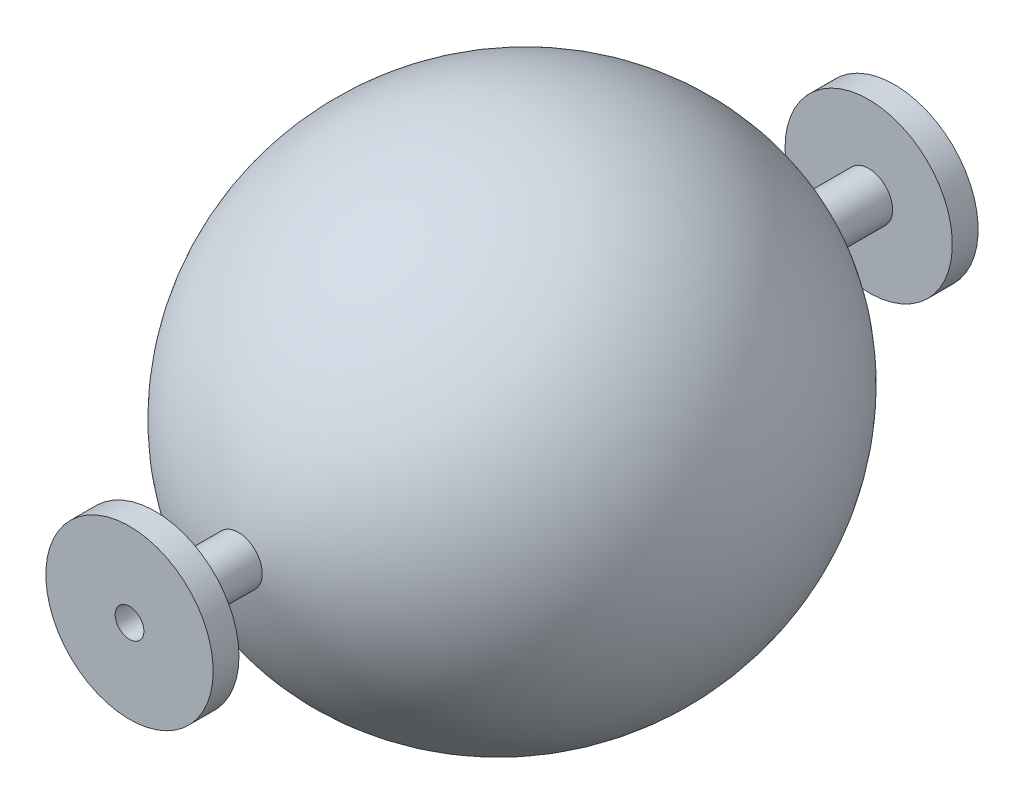
ISO-10303-21;
HEADER;
FILE_DESCRIPTION(('STEP AP214'),'2;1');
FILE_NAME('part.step','',(''),(''),'','','');
FILE_SCHEMA(('AUTOMOTIVE_DESIGN { 1 0 10303 214 1 1 1 1 }'));
ENDSEC;
DATA;
#1=APPLICATION_CONTEXT('core data for automotive mechanical design processes');
#2=APPLICATION_PROTOCOL_DEFINITION('international standard','automotive_design',2000,#1);
#3=PRODUCT_CONTEXT('',#1,'mechanical');
#4=PRODUCT('Part','Part','',(#3));
#5=PRODUCT_RELATED_PRODUCT_CATEGORY('part','',(#4));
#6=PRODUCT_DEFINITION_FORMATION('','',#4);
#7=PRODUCT_DEFINITION_CONTEXT('part definition',#1,'design');
#8=PRODUCT_DEFINITION('design','',#6,#7);
#9=PRODUCT_DEFINITION_SHAPE('','',#8);
#10=(LENGTH_UNIT() NAMED_UNIT(*) SI_UNIT(.MILLI.,.METRE.));
#11=(NAMED_UNIT(*) PLANE_ANGLE_UNIT() SI_UNIT($,.RADIAN.));
#12=(NAMED_UNIT(*) SI_UNIT($,.STERADIAN.) SOLID_ANGLE_UNIT());
#13=UNCERTAINTY_MEASURE_WITH_UNIT(LENGTH_MEASURE(1.E-05),#10,'distance_accuracy_value','');
#14=(GEOMETRIC_REPRESENTATION_CONTEXT(3) GLOBAL_UNCERTAINTY_ASSIGNED_CONTEXT((#13)) GLOBAL_UNIT_ASSIGNED_CONTEXT((#10,
#11,#12)) REPRESENTATION_CONTEXT('',''));
#15=CARTESIAN_POINT('',(0.,0.,0.));
#16=DIRECTION('',(0.,0.,1.));
#17=DIRECTION('',(1.,0.,0.));
#18=AXIS2_PLACEMENT_3D('',#15,#16,#17);
#19=CARTESIAN_POINT('',(0.,0.,40.001));
#20=DIRECTION('',(0.,0.,-1.));
#21=DIRECTION('',(-1.,0.,0.));
#22=AXIS2_PLACEMENT_3D('',#19,#20,#21);
#23=CYLINDRICAL_SURFACE('',#22,2.5);
#24=CARTESIAN_POINT('',(0.,0.,-28.6161600391215));
#25=DIRECTION('',(0.,0.,1.));
#26=DIRECTION('',(1.,0.,0.));
#27=AXIS2_PLACEMENT_3D('',#24,#25,#26);
#28=CIRCLE('',#27,2.5);
#29=CARTESIAN_POINT('',(2.5,0.,-28.6161600391215));
#30=VERTEX_POINT('',#29);
#31=EDGE_CURVE('E43',#30,#30,#28,.F.);
#32=ORIENTED_EDGE('',*,*,#31,.T.);
#33=EDGE_LOOP('',(#32));
#34=FACE_BOUND('',#33,.T.);
#35=CARTESIAN_POINT('',(0.,0.,-37.3));
#36=DIRECTION('',(0.,0.,-1.));
#37=DIRECTION('',(-1.,0.,0.));
#38=AXIS2_PLACEMENT_3D('',#35,#36,#37);
#39=CIRCLE('',#38,2.5);
#40=CARTESIAN_POINT('',(-2.5,0.,-37.3));
#41=VERTEX_POINT('',#40);
#42=EDGE_CURVE('E10',#41,#41,#39,.T.);
#43=ORIENTED_EDGE('',*,*,#42,.F.);
#44=EDGE_LOOP('',(#43));
#45=FACE_BOUND('',#44,.T.);
#46=ADVANCED_FACE('F30',(#34,#45),#23,.T.);
#47=CARTESIAN_POINT('',(0.,0.,-29.001));
#48=DIRECTION('',(0.,0.,1.));
#49=DIRECTION('',(1.,0.,0.));
#50=AXIS2_PLACEMENT_3D('',#47,#48,#49);
#51=CYLINDRICAL_SURFACE('',#50,2.5);
#52=CARTESIAN_POINT('',(0.,0.,28.6161600391215));
#53=DIRECTION('',(0.,0.,-1.));
#54=DIRECTION('',(-1.,0.,0.));
#55=AXIS2_PLACEMENT_3D('',#52,#53,#54);
#56=CIRCLE('',#55,2.5);
#57=CARTESIAN_POINT('',(-2.49999999999999,0.,28.6161600391215));
#58=VERTEX_POINT('',#57);
#59=EDGE_CURVE('E38',#58,#58,#56,.F.);
#60=ORIENTED_EDGE('',*,*,#59,.T.);
#61=EDGE_LOOP('',(#60));
#62=FACE_BOUND('',#61,.T.);
#63=CARTESIAN_POINT('',(0.,0.,37.3));
#64=DIRECTION('',(0.,0.,1.));
#65=DIRECTION('',(1.,0.,0.));
#66=AXIS2_PLACEMENT_3D('',#63,#64,#65);
#67=CIRCLE('',#66,2.5);
#68=CARTESIAN_POINT('',(2.5,0.,37.3));
#69=VERTEX_POINT('',#68);
#70=EDGE_CURVE('E51',#69,#69,#67,.F.);
#71=ORIENTED_EDGE('',*,*,#70,.T.);
#72=EDGE_LOOP('',(#71));
#73=FACE_BOUND('',#72,.T.);
#74=ADVANCED_FACE('F67',(#62,#73),#51,.T.);
#75=CARTESIAN_POINT('',(0.,0.,0.));
#76=DIRECTION('',(0.,0.,-1.));
#77=DIRECTION('',(-1.,0.,0.));
#78=AXIS2_PLACEMENT_3D('',#75,#76,#77);
#79=DEGENERATE_TOROIDAL_SURFACE('',#78,3.17307692307691,29.1730769230769,.F.);
#80=ORIENTED_EDGE('',*,*,#59,.F.);
#81=EDGE_LOOP('',(#80));
#82=FACE_BOUND('',#81,.T.);
#83=ORIENTED_EDGE('',*,*,#31,.F.);
#84=EDGE_LOOP('',(#83));
#85=FACE_BOUND('',#84,.T.);
#86=ADVANCED_FACE('F32',(#82,#85),#79,.F.);
#87=CARTESIAN_POINT('',(0.,0.,37.3));
#88=DIRECTION('',(0.,0.,1.));
#89=DIRECTION('',(1.,0.,0.));
#90=AXIS2_PLACEMENT_3D('',#87,#88,#89);
#91=CYLINDRICAL_SURFACE('',#90,8.75);
#92=CARTESIAN_POINT('',(0.,0.,37.3));
#93=DIRECTION('',(0.,0.,1.));
#94=DIRECTION('',(1.,0.,0.));
#95=AXIS2_PLACEMENT_3D('',#92,#93,#94);
#96=CIRCLE('',#95,8.75);
#97=CARTESIAN_POINT('',(8.75,0.,37.3));
#98=VERTEX_POINT('',#97);
#99=EDGE_CURVE('E48',#98,#98,#96,.T.);
#100=CARTESIAN_POINT('',(0.,0.,40.));
#101=DIRECTION('',(0.,0.,1.));
#102=DIRECTION('',(1.,0.,0.));
#103=AXIS2_PLACEMENT_3D('',#100,#101,#102);
#104=CIRCLE('',#103,8.75);
#105=CARTESIAN_POINT('',(8.75,0.,40.));
#106=VERTEX_POINT('',#105);
#107=EDGE_CURVE('E52',#106,#106,#104,.T.);
#108=CARTESIAN_POINT('',(8.75,0.,37.3));
#109=CARTESIAN_POINT('',(8.75,0.,37.328125));
#110=CARTESIAN_POINT('',(8.75,0.,37.35625));
#111=CARTESIAN_POINT('',(8.75,0.,37.4125));
#112=CARTESIAN_POINT('',(8.75,0.,37.440625));
#113=CARTESIAN_POINT('',(8.75,0.,37.496875));
#114=CARTESIAN_POINT('',(8.75,0.,37.525));
#115=CARTESIAN_POINT('',(8.75,0.,37.58125));
#116=CARTESIAN_POINT('',(8.75,0.,37.609375));
#117=CARTESIAN_POINT('',(8.75,0.,37.665625));
#118=CARTESIAN_POINT('',(8.75,0.,37.69375));
#119=CARTESIAN_POINT('',(8.75,0.,37.75));
#120=CARTESIAN_POINT('',(8.75,0.,37.778125));
#121=CARTESIAN_POINT('',(8.75,0.,37.834375));
#122=CARTESIAN_POINT('',(8.75,0.,37.8625));
#123=CARTESIAN_POINT('',(8.75,0.,37.91875));
#124=CARTESIAN_POINT('',(8.75,0.,37.946875));
#125=CARTESIAN_POINT('',(8.75,0.,38.003125));
#126=CARTESIAN_POINT('',(8.75,0.,38.03125));
#127=CARTESIAN_POINT('',(8.75,0.,38.0875));
#128=CARTESIAN_POINT('',(8.75,0.,38.115625));
#129=CARTESIAN_POINT('',(8.75,0.,38.171875));
#130=CARTESIAN_POINT('',(8.75,0.,38.2));
#131=CARTESIAN_POINT('',(8.75,0.,38.25625));
#132=CARTESIAN_POINT('',(8.75,0.,38.284375));
#133=CARTESIAN_POINT('',(8.75,0.,38.340625));
#134=CARTESIAN_POINT('',(8.75,0.,38.36875));
#135=CARTESIAN_POINT('',(8.75,0.,38.425));
#136=CARTESIAN_POINT('',(8.75,0.,38.453125));
#137=CARTESIAN_POINT('',(8.75,0.,38.509375));
#138=CARTESIAN_POINT('',(8.75,0.,38.5375));
#139=CARTESIAN_POINT('',(8.75,0.,38.59375));
#140=CARTESIAN_POINT('',(8.75,0.,38.621875));
#141=CARTESIAN_POINT('',(8.75,0.,38.678125));
#142=CARTESIAN_POINT('',(8.75,0.,38.70625));
#143=CARTESIAN_POINT('',(8.75,0.,38.7625));
#144=CARTESIAN_POINT('',(8.75,0.,38.790625));
#145=CARTESIAN_POINT('',(8.75,0.,38.846875));
#146=CARTESIAN_POINT('',(8.75,0.,38.875));
#147=CARTESIAN_POINT('',(8.75,0.,38.93125));
#148=CARTESIAN_POINT('',(8.75,0.,38.959375));
#149=CARTESIAN_POINT('',(8.75,0.,39.015625));
#150=CARTESIAN_POINT('',(8.75,0.,39.04375));
#151=CARTESIAN_POINT('',(8.75,0.,39.1));
#152=CARTESIAN_POINT('',(8.75,0.,39.128125));
#153=CARTESIAN_POINT('',(8.75,0.,39.184375));
#154=CARTESIAN_POINT('',(8.75,0.,39.2125));
#155=CARTESIAN_POINT('',(8.75,0.,39.26875));
#156=CARTESIAN_POINT('',(8.75,0.,39.296875));
#157=CARTESIAN_POINT('',(8.75,0.,39.353125));
#158=CARTESIAN_POINT('',(8.75,0.,39.38125));
#159=CARTESIAN_POINT('',(8.75,0.,39.4375));
#160=CARTESIAN_POINT('',(8.75,0.,39.465625));
#161=CARTESIAN_POINT('',(8.75,0.,39.521875));
#162=CARTESIAN_POINT('',(8.75,0.,39.55));
#163=CARTESIAN_POINT('',(8.75,0.,39.60625));
#164=CARTESIAN_POINT('',(8.75,0.,39.634375));
#165=CARTESIAN_POINT('',(8.75,0.,39.690625));
#166=CARTESIAN_POINT('',(8.75,0.,39.71875));
#167=CARTESIAN_POINT('',(8.75,0.,39.775));
#168=CARTESIAN_POINT('',(8.75,0.,39.803125));
#169=CARTESIAN_POINT('',(8.75,0.,39.859375));
#170=CARTESIAN_POINT('',(8.75,0.,39.8875));
#171=CARTESIAN_POINT('',(8.75,0.,39.94375));
#172=CARTESIAN_POINT('',(8.75,0.,39.971875));
#173=CARTESIAN_POINT('',(8.75,0.,40.));
#174=B_SPLINE_CURVE_WITH_KNOTS('',3,(#108,#109,#110,#111,#112,#113,#114,#115,#116,#117,#118,
#119,#120,#121,#122,#123,#124,#125,#126,#127,#128,#129,#130,#131,#132,#133,#134,#135,#136,#137,
#138,#139,#140,#141,#142,#143,#144,#145,#146,#147,#148,#149,#150,#151,#152,#153,#154,#155,#156,
#157,#158,#159,#160,#161,#162,#163,#164,#165,#166,#167,#168,#169,#170,#171,#172,#173),
.UNSPECIFIED.,.F.,.F.,(4,2,2,2,2,2,2,2,2,2,2,2,2,2,2,2,2,2,2,2,2,2,2,2,2,2,2,2,2,2,2,2,4),(0.,
0.0843749999999976,0.168749999999995,0.253125,0.337499999999998,0.421874999999995,0.50625,
0.590624999999997,0.674999999999995,0.759375,0.843749999999997,0.928124999999995,1.0125,
1.096875,1.18124999999999,1.265625,1.35,1.43437499999999,1.51875,1.603125,1.68749999999999,
1.771875,1.85625,1.94062499999999,2.025,2.109375,2.19374999999999,2.278125,2.3625,2.446875,
2.53125,2.615625,2.7),.UNSPECIFIED.);
#175=EDGE_CURVE('BSEAM66',#98,#106,#174,.T.);
#176=ORIENTED_EDGE('',*,*,#99,.T.);
#177=ORIENTED_EDGE('',*,*,#107,.F.);
#178=ORIENTED_EDGE('',*,*,#175,.T.);
#179=ORIENTED_EDGE('',*,*,#175,.F.);
#180=EDGE_LOOP('',(#176,#178,#177,#179));
#181=FACE_BOUND('',#180,.T.);
#182=ADVANCED_FACE('F66',(#181),#91,.T.);
#183=CARTESIAN_POINT('',(0.,0.,37.3));
#184=DIRECTION('',(0.,0.,1.));
#185=DIRECTION('',(1.,0.,0.));
#186=AXIS2_PLACEMENT_3D('',#183,#184,#185);
#187=PLANE('',#186);
#188=ORIENTED_EDGE('',*,*,#70,.F.);
#189=EDGE_LOOP('',(#188));
#190=FACE_BOUND('',#189,.T.);
#191=ORIENTED_EDGE('',*,*,#99,.F.);
#192=EDGE_LOOP('',(#191));
#193=FACE_BOUND('',#192,.T.);
#194=ADVANCED_FACE('F73',(#190,#193),#187,.F.);
#195=CARTESIAN_POINT('',(0.,0.,40.));
#196=DIRECTION('',(0.,0.,1.));
#197=DIRECTION('',(1.,0.,0.));
#198=AXIS2_PLACEMENT_3D('',#195,#196,#197);
#199=PLANE('',#198);
#200=CARTESIAN_POINT('',(0.,0.,40.));
#201=DIRECTION('',(0.,0.,1.));
#202=DIRECTION('',(1.,0.,0.));
#203=AXIS2_PLACEMENT_3D('',#200,#201,#202);
#204=CIRCLE('',#203,1.5);
#205=CARTESIAN_POINT('',(1.5,0.,40.));
#206=VERTEX_POINT('',#205);
#207=EDGE_CURVE('E102',#206,#206,#204,.T.);
#208=ORIENTED_EDGE('',*,*,#207,.F.);
#209=EDGE_LOOP('',(#208));
#210=FACE_BOUND('',#209,.T.);
#211=ORIENTED_EDGE('',*,*,#107,.T.);
#212=EDGE_LOOP('',(#211));
#213=FACE_BOUND('',#212,.T.);
#214=ADVANCED_FACE('F86',(#210,#213),#199,.T.);
#215=CARTESIAN_POINT('',(0.,0.,-37.3));
#216=DIRECTION('',(0.,0.,-1.));
#217=DIRECTION('',(-1.,0.,0.));
#218=AXIS2_PLACEMENT_3D('',#215,#216,#217);
#219=CYLINDRICAL_SURFACE('',#218,8.75);
#220=CARTESIAN_POINT('',(0.,0.,-37.3));
#221=DIRECTION('',(0.,0.,-1.));
#222=DIRECTION('',(-1.,0.,0.));
#223=AXIS2_PLACEMENT_3D('',#220,#221,#222);
#224=CIRCLE('',#223,8.75);
#225=CARTESIAN_POINT('',(-8.75,0.,-37.3));
#226=VERTEX_POINT('',#225);
#227=EDGE_CURVE('E110',#226,#226,#224,.T.);
#228=CARTESIAN_POINT('',(0.,0.,-40.));
#229=DIRECTION('',(0.,0.,-1.));
#230=DIRECTION('',(-1.,0.,0.));
#231=AXIS2_PLACEMENT_3D('',#228,#229,#230);
#232=CIRCLE('',#231,8.75);
#233=CARTESIAN_POINT('',(-8.75,0.,-40.));
#234=VERTEX_POINT('',#233);
#235=EDGE_CURVE('E46',#234,#234,#232,.T.);
#236=CARTESIAN_POINT('',(-8.75,0.,-37.3));
#237=CARTESIAN_POINT('',(-8.75,0.,-37.328125));
#238=CARTESIAN_POINT('',(-8.75,0.,-37.35625));
#239=CARTESIAN_POINT('',(-8.75,0.,-37.4125));
#240=CARTESIAN_POINT('',(-8.75,0.,-37.440625));
#241=CARTESIAN_POINT('',(-8.75,0.,-37.496875));
#242=CARTESIAN_POINT('',(-8.75,0.,-37.525));
#243=CARTESIAN_POINT('',(-8.75,0.,-37.58125));
#244=CARTESIAN_POINT('',(-8.75,0.,-37.609375));
#245=CARTESIAN_POINT('',(-8.75,0.,-37.665625));
#246=CARTESIAN_POINT('',(-8.75,0.,-37.69375));
#247=CARTESIAN_POINT('',(-8.75,0.,-37.75));
#248=CARTESIAN_POINT('',(-8.75,0.,-37.778125));
#249=CARTESIAN_POINT('',(-8.75,0.,-37.834375));
#250=CARTESIAN_POINT('',(-8.75,0.,-37.8625));
#251=CARTESIAN_POINT('',(-8.75,0.,-37.91875));
#252=CARTESIAN_POINT('',(-8.75,0.,-37.946875));
#253=CARTESIAN_POINT('',(-8.75,0.,-38.003125));
#254=CARTESIAN_POINT('',(-8.75,0.,-38.03125));
#255=CARTESIAN_POINT('',(-8.75,0.,-38.0875));
#256=CARTESIAN_POINT('',(-8.75,0.,-38.115625));
#257=CARTESIAN_POINT('',(-8.75,0.,-38.171875));
#258=CARTESIAN_POINT('',(-8.75,0.,-38.2));
#259=CARTESIAN_POINT('',(-8.75,0.,-38.25625));
#260=CARTESIAN_POINT('',(-8.75,0.,-38.284375));
#261=CARTESIAN_POINT('',(-8.75,0.,-38.340625));
#262=CARTESIAN_POINT('',(-8.75,0.,-38.36875));
#263=CARTESIAN_POINT('',(-8.75,0.,-38.425));
#264=CARTESIAN_POINT('',(-8.75,0.,-38.453125));
#265=CARTESIAN_POINT('',(-8.75,0.,-38.509375));
#266=CARTESIAN_POINT('',(-8.75,0.,-38.5375));
#267=CARTESIAN_POINT('',(-8.75,0.,-38.59375));
#268=CARTESIAN_POINT('',(-8.75,0.,-38.621875));
#269=CARTESIAN_POINT('',(-8.75,0.,-38.678125));
#270=CARTESIAN_POINT('',(-8.75,0.,-38.70625));
#271=CARTESIAN_POINT('',(-8.75,0.,-38.7625));
#272=CARTESIAN_POINT('',(-8.75,0.,-38.790625));
#273=CARTESIAN_POINT('',(-8.75,0.,-38.846875));
#274=CARTESIAN_POINT('',(-8.75,0.,-38.875));
#275=CARTESIAN_POINT('',(-8.75,0.,-38.93125));
#276=CARTESIAN_POINT('',(-8.75,0.,-38.959375));
#277=CARTESIAN_POINT('',(-8.75,0.,-39.015625));
#278=CARTESIAN_POINT('',(-8.75,0.,-39.04375));
#279=CARTESIAN_POINT('',(-8.75,0.,-39.1));
#280=CARTESIAN_POINT('',(-8.75,0.,-39.128125));
#281=CARTESIAN_POINT('',(-8.75,0.,-39.184375));
#282=CARTESIAN_POINT('',(-8.75,0.,-39.2125));
#283=CARTESIAN_POINT('',(-8.75,0.,-39.26875));
#284=CARTESIAN_POINT('',(-8.75,0.,-39.296875));
#285=CARTESIAN_POINT('',(-8.75,0.,-39.353125));
#286=CARTESIAN_POINT('',(-8.75,0.,-39.38125));
#287=CARTESIAN_POINT('',(-8.75,0.,-39.4375));
#288=CARTESIAN_POINT('',(-8.75,0.,-39.465625));
#289=CARTESIAN_POINT('',(-8.75,0.,-39.521875));
#290=CARTESIAN_POINT('',(-8.75,0.,-39.55));
#291=CARTESIAN_POINT('',(-8.75,0.,-39.60625));
#292=CARTESIAN_POINT('',(-8.75,0.,-39.634375));
#293=CARTESIAN_POINT('',(-8.75,0.,-39.690625));
#294=CARTESIAN_POINT('',(-8.75,0.,-39.71875));
#295=CARTESIAN_POINT('',(-8.75,0.,-39.775));
#296=CARTESIAN_POINT('',(-8.75,0.,-39.803125));
#297=CARTESIAN_POINT('',(-8.75,0.,-39.859375));
#298=CARTESIAN_POINT('',(-8.75,0.,-39.8875));
#299=CARTESIAN_POINT('',(-8.75,0.,-39.94375));
#300=CARTESIAN_POINT('',(-8.75,0.,-39.971875));
#301=CARTESIAN_POINT('',(-8.75,0.,-40.));
#302=B_SPLINE_CURVE_WITH_KNOTS('',3,(#236,#237,#238,#239,#240,#241,#242,#243,#244,#245,#246,
#247,#248,#249,#250,#251,#252,#253,#254,#255,#256,#257,#258,#259,#260,#261,#262,#263,#264,#265,
#266,#267,#268,#269,#270,#271,#272,#273,#274,#275,#276,#277,#278,#279,#280,#281,#282,#283,#284,
#285,#286,#287,#288,#289,#290,#291,#292,#293,#294,#295,#296,#297,#298,#299,#300,#301),
.UNSPECIFIED.,.F.,.F.,(4,2,2,2,2,2,2,2,2,2,2,2,2,2,2,2,2,2,2,2,2,2,2,2,2,2,2,2,2,2,2,2,4),(0.,
0.0843749999999976,0.168749999999995,0.253125,0.337499999999998,0.421874999999995,0.50625,
0.590624999999997,0.674999999999995,0.759375,0.843749999999997,0.928124999999995,1.0125,
1.096875,1.18124999999999,1.265625,1.35,1.43437499999999,1.51875,1.603125,1.68749999999999,
1.771875,1.85625,1.94062499999999,2.025,2.109375,2.19374999999999,2.278125,2.3625,2.446875,
2.53125,2.615625,2.7),.UNSPECIFIED.);
#303=EDGE_CURVE('BSEAM88',#226,#234,#302,.T.);
#304=ORIENTED_EDGE('',*,*,#227,.T.);
#305=ORIENTED_EDGE('',*,*,#235,.F.);
#306=ORIENTED_EDGE('',*,*,#303,.T.);
#307=ORIENTED_EDGE('',*,*,#303,.F.);
#308=EDGE_LOOP('',(#304,#306,#305,#307));
#309=FACE_BOUND('',#308,.T.);
#310=ADVANCED_FACE('F88',(#309),#219,.T.);
#311=CARTESIAN_POINT('',(0.,0.,-37.3));
#312=DIRECTION('',(0.,0.,-1.));
#313=DIRECTION('',(-1.,0.,0.));
#314=AXIS2_PLACEMENT_3D('',#311,#312,#313);
#315=PLANE('',#314);
#316=ORIENTED_EDGE('',*,*,#42,.T.);
#317=EDGE_LOOP('',(#316));
#318=FACE_BOUND('',#317,.T.);
#319=ORIENTED_EDGE('',*,*,#227,.F.);
#320=EDGE_LOOP('',(#319));
#321=FACE_BOUND('',#320,.T.);
#322=ADVANCED_FACE('F94',(#318,#321),#315,.F.);
#323=CARTESIAN_POINT('',(0.,0.,-40.));
#324=DIRECTION('',(0.,0.,1.));
#325=DIRECTION('',(1.,0.,0.));
#326=AXIS2_PLACEMENT_3D('',#323,#324,#325);
#327=PLANE('',#326);
#328=ORIENTED_EDGE('',*,*,#235,.T.);
#329=EDGE_LOOP('',(#328));
#330=FACE_BOUND('',#329,.T.);
#331=ADVANCED_FACE('F84',(#330),#327,.F.);
#332=CARTESIAN_POINT('',(0.,0.,-40.001));
#333=DIRECTION('',(0.,0.,1.));
#334=DIRECTION('',(1.,0.,0.));
#335=AXIS2_PLACEMENT_3D('',#332,#333,#334);
#336=CYLINDRICAL_SURFACE('',#335,1.5);
#337=ORIENTED_EDGE('',*,*,#207,.T.);
#338=EDGE_LOOP('',(#337));
#339=FACE_BOUND('',#338,.T.);
#340=CARTESIAN_POINT('',(0.,0.,27.2756583506528));
#341=DIRECTION('',(0.,0.,-1.));
#342=DIRECTION('',(-1.,0.,0.));
#343=AXIS2_PLACEMENT_3D('',#340,#341,#342);
#344=CIRCLE('',#343,1.5);
#345=CARTESIAN_POINT('',(-1.49999999999999,0.,27.2756583506528));
#346=VERTEX_POINT('',#345);
#347=EDGE_CURVE('E106',#346,#346,#344,.T.);
#348=ORIENTED_EDGE('',*,*,#347,.T.);
#349=EDGE_LOOP('',(#348));
#350=FACE_BOUND('',#349,.T.);
#351=ADVANCED_FACE('F119',(#339,#350),#336,.F.);
#352=CARTESIAN_POINT('',(0.,0.,40.001));
#353=DIRECTION('',(0.,0.,-1.));
#354=DIRECTION('',(-1.,0.,0.));
#355=AXIS2_PLACEMENT_3D('',#352,#353,#354);
#356=CYLINDRICAL_SURFACE('',#355,1.);
#357=CARTESIAN_POINT('',(0.,0.,-27.3566192243233));
#358=DIRECTION('',(0.,0.,1.));
#359=DIRECTION('',(1.,0.,0.));
#360=AXIS2_PLACEMENT_3D('',#357,#358,#359);
#361=CIRCLE('',#360,1.);
#362=CARTESIAN_POINT('',(1.,0.,-27.3566192243233));
#363=VERTEX_POINT('',#362);
#364=EDGE_CURVE('E57',#363,#363,#361,.F.);
#365=ORIENTED_EDGE('',*,*,#364,.F.);
#366=EDGE_LOOP('',(#365));
#367=FACE_BOUND('',#366,.T.);
#368=CARTESIAN_POINT('',(0.,0.,-37.3));
#369=DIRECTION('',(0.,0.,-1.));
#370=DIRECTION('',(-1.,0.,0.));
#371=AXIS2_PLACEMENT_3D('',#368,#369,#370);
#372=CIRCLE('',#371,1.);
#373=CARTESIAN_POINT('',(-1.,0.,-37.3));
#374=VERTEX_POINT('',#373);
#375=EDGE_CURVE('E34',#374,#374,#372,.T.);
#376=ORIENTED_EDGE('',*,*,#375,.T.);
#377=EDGE_LOOP('',(#376));
#378=FACE_BOUND('',#377,.T.);
#379=ADVANCED_FACE('F124',(#367,#378),#356,.F.);
#380=CARTESIAN_POINT('',(0.,0.,0.));
#381=DIRECTION('',(0.,0.,-1.));
#382=DIRECTION('',(-1.,0.,0.));
#383=AXIS2_PLACEMENT_3D('',#380,#381,#382);
#384=DEGENERATE_TOROIDAL_SURFACE('',#383,3.17307692307691,27.6730769230769,.F.);
#385=ORIENTED_EDGE('',*,*,#347,.F.);
#386=EDGE_LOOP('',(#385));
#387=FACE_BOUND('',#386,.T.);
#388=ORIENTED_EDGE('',*,*,#364,.T.);
#389=EDGE_LOOP('',(#388));
#390=FACE_BOUND('',#389,.T.);
#391=ADVANCED_FACE('F132',(#387,#390),#384,.T.);
#392=ORIENTED_EDGE('',*,*,#375,.F.);
#393=EDGE_LOOP('',(#392));
#394=FACE_BOUND('',#393,.T.);
#395=ADVANCED_FACE('F127',(#394),#315,.F.);
#396=CLOSED_SHELL('',(#46,#74,#86,#182,#194,#214,#310,#322,#331,#351,#379,#391,#395));
#397=MANIFOLD_SOLID_BREP('B2',#396);
#398=ADVANCED_BREP_SHAPE_REPRESENTATION('',(#18,#397),#14);
#399=SHAPE_DEFINITION_REPRESENTATION(#9,#398);
ENDSEC;
END-ISO-10303-21;
